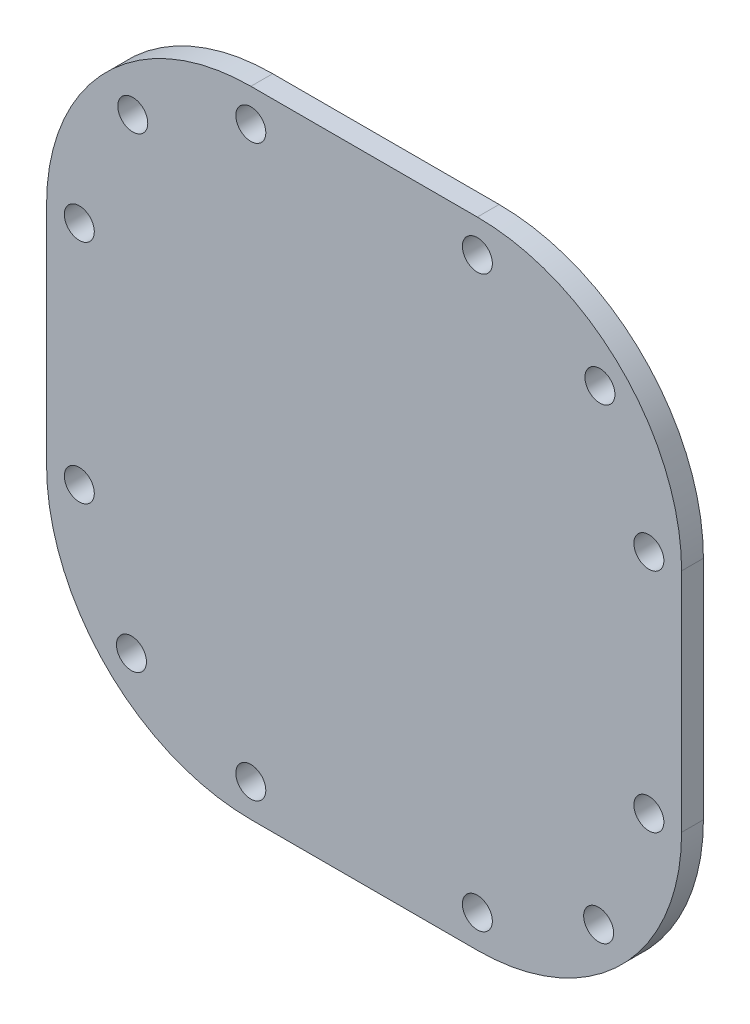
ISO-10303-21;
HEADER;
FILE_DESCRIPTION(('STEP AP214'),'2;1');
FILE_NAME('part.step','',(''),(''),'','','');
FILE_SCHEMA(('AUTOMOTIVE_DESIGN { 1 0 10303 214 1 1 1 1 }'));
ENDSEC;
DATA;
#1=APPLICATION_CONTEXT('core data for automotive mechanical design processes');
#2=APPLICATION_PROTOCOL_DEFINITION('international standard','automotive_design',2000,#1);
#3=PRODUCT_CONTEXT('',#1,'mechanical');
#4=PRODUCT('Part','Part','',(#3));
#5=PRODUCT_RELATED_PRODUCT_CATEGORY('part','',(#4));
#6=PRODUCT_DEFINITION_FORMATION('','',#4);
#7=PRODUCT_DEFINITION_CONTEXT('part definition',#1,'design');
#8=PRODUCT_DEFINITION('design','',#6,#7);
#9=PRODUCT_DEFINITION_SHAPE('','',#8);
#10=(LENGTH_UNIT() NAMED_UNIT(*) SI_UNIT(.MILLI.,.METRE.));
#11=(NAMED_UNIT(*) PLANE_ANGLE_UNIT() SI_UNIT($,.RADIAN.));
#12=(NAMED_UNIT(*) SI_UNIT($,.STERADIAN.) SOLID_ANGLE_UNIT());
#13=UNCERTAINTY_MEASURE_WITH_UNIT(LENGTH_MEASURE(1.E-05),#10,'distance_accuracy_value','');
#14=(GEOMETRIC_REPRESENTATION_CONTEXT(3) GLOBAL_UNCERTAINTY_ASSIGNED_CONTEXT((#13)) GLOBAL_UNIT_ASSIGNED_CONTEXT((#10,
#11,#12)) REPRESENTATION_CONTEXT('',''));
#15=CARTESIAN_POINT('',(0.,0.,0.));
#16=DIRECTION('',(0.,0.,1.));
#17=DIRECTION('',(1.,0.,0.));
#18=AXIS2_PLACEMENT_3D('',#15,#16,#17);
#19=CARTESIAN_POINT('',(-46.57725,46.57725,3.175));
#20=DIRECTION('',(0.,0.,-1.));
#21=DIRECTION('',(-1.,0.,0.));
#22=AXIS2_PLACEMENT_3D('',#19,#20,#21);
#23=PLANE('',#22);
#24=CARTESIAN_POINT('',(16.490011721749,-41.4629701831703,3.175));
#25=DIRECTION('',(0.,0.,1.));
#26=DIRECTION('',(1.,0.,0.));
#27=AXIS2_PLACEMENT_3D('',#24,#25,#26);
#28=CIRCLE('',#27,2.1828125);
#29=CARTESIAN_POINT('',(18.672824221749,-41.4629701831703,3.175));
#30=VERTEX_POINT('',#29);
#31=EDGE_CURVE('E11',#30,#30,#28,.T.);
#32=ORIENTED_EDGE('',*,*,#31,.F.);
#33=EDGE_LOOP('',(#32));
#34=FACE_BOUND('',#33,.T.);
#35=CARTESIAN_POINT('',(-41.4629701831717,-16.4922403663435,3.175));
#36=DIRECTION('',(0.,0.,1.));
#37=DIRECTION('',(1.,0.,0.));
#38=AXIS2_PLACEMENT_3D('',#35,#36,#37);
#39=CIRCLE('',#38,2.1828125);
#40=CARTESIAN_POINT('',(-39.2801576831717,-16.4922403663435,3.175));
#41=VERTEX_POINT('',#40);
#42=EDGE_CURVE('E174',#41,#41,#39,.T.);
#43=ORIENTED_EDGE('',*,*,#42,.F.);
#44=EDGE_LOOP('',(#43));
#45=FACE_BOUND('',#44,.T.);
#46=CARTESIAN_POINT('',(-16.4944690109381,-41.4629701831703,3.175));
#47=DIRECTION('',(0.,0.,1.));
#48=DIRECTION('',(1.,0.,0.));
#49=AXIS2_PLACEMENT_3D('',#46,#47,#48);
#50=CIRCLE('',#49,2.1828125);
#51=CARTESIAN_POINT('',(-14.3116565109381,-41.4629701831703,3.175));
#52=VERTEX_POINT('',#51);
#53=EDGE_CURVE('E181',#52,#52,#50,.T.);
#54=ORIENTED_EDGE('',*,*,#53,.F.);
#55=EDGE_LOOP('',(#54));
#56=FACE_BOUND('',#55,.T.);
#57=CARTESIAN_POINT('',(-33.8692708431518,-33.9592080618209,3.175));
#58=DIRECTION('',(0.,0.,1.));
#59=DIRECTION('',(1.,0.,0.));
#60=AXIS2_PLACEMENT_3D('',#57,#58,#59);
#61=CIRCLE('',#60,2.1828125);
#62=CARTESIAN_POINT('',(-31.6864583431518,-33.9592080618209,3.175));
#63=VERTEX_POINT('',#62);
#64=EDGE_CURVE('E168',#63,#63,#61,.T.);
#65=ORIENTED_EDGE('',*,*,#64,.F.);
#66=EDGE_LOOP('',(#65));
#67=FACE_BOUND('',#66,.T.);
#68=CARTESIAN_POINT('',(-41.4629701831717,16.4922403663436,3.175));
#69=DIRECTION('',(0.,0.,1.));
#70=DIRECTION('',(1.,0.,0.));
#71=AXIS2_PLACEMENT_3D('',#68,#69,#70);
#72=CIRCLE('',#71,2.1828125);
#73=CARTESIAN_POINT('',(-39.2801576831717,16.4922403663436,3.175));
#74=VERTEX_POINT('',#73);
#75=EDGE_CURVE('E228',#74,#74,#72,.T.);
#76=ORIENTED_EDGE('',*,*,#75,.F.);
#77=EDGE_LOOP('',(#76));
#78=FACE_BOUND('',#77,.T.);
#79=CARTESIAN_POINT('',(-33.6810550046073,34.0574866816963,3.175));
#80=DIRECTION('',(0.,0.,1.));
#81=DIRECTION('',(1.,0.,0.));
#82=AXIS2_PLACEMENT_3D('',#79,#80,#81);
#83=CIRCLE('',#82,2.1828125);
#84=CARTESIAN_POINT('',(-31.4982425046073,34.0574866816963,3.175));
#85=VERTEX_POINT('',#84);
#86=EDGE_CURVE('E222',#85,#85,#83,.T.);
#87=ORIENTED_EDGE('',*,*,#86,.F.);
#88=EDGE_LOOP('',(#87));
#89=FACE_BOUND('',#88,.T.);
#90=CARTESIAN_POINT('',(-16.4922403663449,41.4607415385772,3.175));
#91=DIRECTION('',(0.,0.,1.));
#92=DIRECTION('',(1.,0.,0.));
#93=AXIS2_PLACEMENT_3D('',#90,#91,#92);
#94=CIRCLE('',#93,2.1828125);
#95=CARTESIAN_POINT('',(-14.3094278663449,41.4607415385772,3.175));
#96=VERTEX_POINT('',#95);
#97=EDGE_CURVE('E216',#96,#96,#94,.T.);
#98=ORIENTED_EDGE('',*,*,#97,.F.);
#99=EDGE_LOOP('',(#98));
#100=FACE_BOUND('',#99,.T.);
#101=CARTESIAN_POINT('',(16.4922403663421,41.4607415385772,3.175));
#102=DIRECTION('',(0.,0.,1.));
#103=DIRECTION('',(1.,0.,0.));
#104=AXIS2_PLACEMENT_3D('',#101,#102,#103);
#105=CIRCLE('',#104,2.1828125);
#106=CARTESIAN_POINT('',(18.6750528663421,41.4607415385772,3.175));
#107=VERTEX_POINT('',#106);
#108=EDGE_CURVE('E210',#107,#107,#105,.T.);
#109=ORIENTED_EDGE('',*,*,#108,.F.);
#110=EDGE_LOOP('',(#109));
#111=FACE_BOUND('',#110,.T.);
#112=CARTESIAN_POINT('',(34.33563973891,33.8692708431518,3.175));
#113=DIRECTION('',(0.,0.,1.));
#114=DIRECTION('',(1.,0.,0.));
#115=AXIS2_PLACEMENT_3D('',#112,#113,#114);
#116=CIRCLE('',#115,2.1828125);
#117=CARTESIAN_POINT('',(36.51845223891,33.8692708431518,3.175));
#118=VERTEX_POINT('',#117);
#119=EDGE_CURVE('E204',#118,#118,#116,.T.);
#120=ORIENTED_EDGE('',*,*,#119,.F.);
#121=EDGE_LOOP('',(#120));
#122=FACE_BOUND('',#121,.T.);
#123=CARTESIAN_POINT('',(41.4607415385758,16.4900117217504,3.175));
#124=DIRECTION('',(0.,0.,1.));
#125=DIRECTION('',(1.,0.,0.));
#126=AXIS2_PLACEMENT_3D('',#123,#124,#125);
#127=CIRCLE('',#126,2.1828125);
#128=CARTESIAN_POINT('',(43.6435540385758,16.4900117217504,3.175));
#129=VERTEX_POINT('',#128);
#130=EDGE_CURVE('E198',#129,#129,#127,.T.);
#131=ORIENTED_EDGE('',*,*,#130,.F.);
#132=EDGE_LOOP('',(#131));
#133=FACE_BOUND('',#132,.T.);
#134=CARTESIAN_POINT('',(41.4607415385758,-16.4944690109366,3.175));
#135=DIRECTION('',(0.,0.,1.));
#136=DIRECTION('',(1.,0.,0.));
#137=AXIS2_PLACEMENT_3D('',#134,#135,#136);
#138=CIRCLE('',#137,2.1828125);
#139=CARTESIAN_POINT('',(43.6435540385758,-16.4944690109366,3.175));
#140=VERTEX_POINT('',#139);
#141=EDGE_CURVE('E192',#140,#140,#138,.T.);
#142=ORIENTED_EDGE('',*,*,#141,.F.);
#143=EDGE_LOOP('',(#142));
#144=FACE_BOUND('',#143,.T.);
#145=CARTESIAN_POINT('',(34.1474239003655,-34.1474239003655,3.175));
#146=DIRECTION('',(0.,0.,1.));
#147=DIRECTION('',(1.,0.,0.));
#148=AXIS2_PLACEMENT_3D('',#145,#146,#147);
#149=CIRCLE('',#148,2.1828125);
#150=CARTESIAN_POINT('',(36.3302364003655,-34.1474239003655,3.175));
#151=VERTEX_POINT('',#150);
#152=EDGE_CURVE('E186',#151,#151,#149,.T.);
#153=ORIENTED_EDGE('',*,*,#152,.F.);
#154=EDGE_LOOP('',(#153));
#155=FACE_BOUND('',#154,.T.);
#156=CARTESIAN_POINT('',(-16.4846,16.4846,3.175));
#157=DIRECTION('',(0.,0.,1.));
#158=DIRECTION('',(-1.,0.,0.));
#159=AXIS2_PLACEMENT_3D('',#156,#157,#158);
#160=CIRCLE('',#159,29.7434);
#161=CARTESIAN_POINT('',(-16.4846,46.228,3.175));
#162=VERTEX_POINT('',#161);
#163=CARTESIAN_POINT('',(-46.228,16.4846,3.175));
#164=VERTEX_POINT('',#163);
#165=EDGE_CURVE('E136',#162,#164,#160,.T.);
#166=ORIENTED_EDGE('',*,*,#165,.T.);
#167=DIRECTION('',(0.,-1.,0.));
#168=VECTOR('',#167,1.);
#169=CARTESIAN_POINT('',(-46.228,-16.4846,3.175));
#170=LINE('',#169,#168);
#171=CARTESIAN_POINT('',(-46.228,-16.4846,3.175));
#172=VERTEX_POINT('',#171);
#173=EDGE_CURVE('E139',#164,#172,#170,.T.);
#174=ORIENTED_EDGE('',*,*,#173,.T.);
#175=CARTESIAN_POINT('',(-16.4846,-16.4846,3.175));
#176=DIRECTION('',(0.,0.,1.));
#177=DIRECTION('',(-1.,0.,0.));
#178=AXIS2_PLACEMENT_3D('',#175,#176,#177);
#179=CIRCLE('',#178,29.7434);
#180=CARTESIAN_POINT('',(-16.4846,-46.228,3.175));
#181=VERTEX_POINT('',#180);
#182=EDGE_CURVE('E50',#172,#181,#179,.T.);
#183=ORIENTED_EDGE('',*,*,#182,.T.);
#184=DIRECTION('',(1.,0.,0.));
#185=VECTOR('',#184,1.);
#186=CARTESIAN_POINT('',(16.4846,-46.228,3.175));
#187=LINE('',#186,#185);
#188=CARTESIAN_POINT('',(16.4846,-46.228,3.175));
#189=VERTEX_POINT('',#188);
#190=EDGE_CURVE('E107',#181,#189,#187,.T.);
#191=ORIENTED_EDGE('',*,*,#190,.T.);
#192=CARTESIAN_POINT('',(16.4846,-16.4846,3.175));
#193=DIRECTION('',(0.,0.,1.));
#194=DIRECTION('',(-1.,0.,0.));
#195=AXIS2_PLACEMENT_3D('',#192,#193,#194);
#196=CIRCLE('',#195,29.7434);
#197=CARTESIAN_POINT('',(46.228,-16.4846,3.175));
#198=VERTEX_POINT('',#197);
#199=EDGE_CURVE('E144',#189,#198,#196,.T.);
#200=ORIENTED_EDGE('',*,*,#199,.T.);
#201=DIRECTION('',(0.,1.,0.));
#202=VECTOR('',#201,1.);
#203=CARTESIAN_POINT('',(46.228,-16.4846,3.175));
#204=LINE('',#203,#202);
#205=CARTESIAN_POINT('',(46.228,16.4846,3.175));
#206=VERTEX_POINT('',#205);
#207=EDGE_CURVE('E147',#198,#206,#204,.T.);
#208=ORIENTED_EDGE('',*,*,#207,.T.);
#209=CARTESIAN_POINT('',(16.4846,16.4846,3.175));
#210=DIRECTION('',(0.,0.,1.));
#211=DIRECTION('',(-1.,0.,0.));
#212=AXIS2_PLACEMENT_3D('',#209,#210,#211);
#213=CIRCLE('',#212,29.7434);
#214=CARTESIAN_POINT('',(16.4846,46.228,3.175));
#215=VERTEX_POINT('',#214);
#216=EDGE_CURVE('E150',#206,#215,#213,.T.);
#217=ORIENTED_EDGE('',*,*,#216,.T.);
#218=DIRECTION('',(-1.,0.,0.));
#219=VECTOR('',#218,1.);
#220=CARTESIAN_POINT('',(16.4846,46.228,3.175));
#221=LINE('',#220,#219);
#222=EDGE_CURVE('E153',#215,#162,#221,.T.);
#223=ORIENTED_EDGE('',*,*,#222,.T.);
#224=EDGE_LOOP('',(#166,#174,#183,#191,#200,#208,#217,#223));
#225=FACE_BOUND('',#224,.T.);
#226=ADVANCED_FACE('F35',(#34,#45,#56,#67,#78,#89,#100,#111,#122,#133,#144,#155,#225),#23,.F.);
#227=CARTESIAN_POINT('',(-46.57725,46.57725,0.));
#228=DIRECTION('',(0.,0.,-1.));
#229=DIRECTION('',(-1.,0.,0.));
#230=AXIS2_PLACEMENT_3D('',#227,#228,#229);
#231=PLANE('',#230);
#232=CARTESIAN_POINT('',(16.490011721749,-41.4629701831703,0.));
#233=DIRECTION('',(0.,0.,-1.));
#234=DIRECTION('',(-1.,0.,0.));
#235=AXIS2_PLACEMENT_3D('',#232,#233,#234);
#236=CIRCLE('',#235,2.1828125);
#237=CARTESIAN_POINT('',(14.307199221749,-41.4629701831703,0.));
#238=VERTEX_POINT('',#237);
#239=EDGE_CURVE('E39',#238,#238,#236,.F.);
#240=ORIENTED_EDGE('',*,*,#239,.T.);
#241=EDGE_LOOP('',(#240));
#242=FACE_BOUND('',#241,.T.);
#243=CARTESIAN_POINT('',(-41.4629701831717,-16.4922403663435,0.));
#244=DIRECTION('',(0.,0.,-1.));
#245=DIRECTION('',(-1.,0.,0.));
#246=AXIS2_PLACEMENT_3D('',#243,#244,#245);
#247=CIRCLE('',#246,2.1828125);
#248=CARTESIAN_POINT('',(-43.6457826831717,-16.4922403663435,0.));
#249=VERTEX_POINT('',#248);
#250=EDGE_CURVE('E178',#249,#249,#247,.F.);
#251=ORIENTED_EDGE('',*,*,#250,.T.);
#252=EDGE_LOOP('',(#251));
#253=FACE_BOUND('',#252,.T.);
#254=CARTESIAN_POINT('',(-16.4944690109381,-41.4629701831703,0.));
#255=DIRECTION('',(0.,0.,-1.));
#256=DIRECTION('',(-1.,0.,0.));
#257=AXIS2_PLACEMENT_3D('',#254,#255,#256);
#258=CIRCLE('',#257,2.1828125);
#259=CARTESIAN_POINT('',(-18.6772815109381,-41.4629701831703,0.));
#260=VERTEX_POINT('',#259);
#261=EDGE_CURVE('E171',#260,#260,#258,.F.);
#262=ORIENTED_EDGE('',*,*,#261,.T.);
#263=EDGE_LOOP('',(#262));
#264=FACE_BOUND('',#263,.T.);
#265=CARTESIAN_POINT('',(-33.8692708431518,-33.9592080618209,0.));
#266=DIRECTION('',(0.,0.,-1.));
#267=DIRECTION('',(-1.,0.,0.));
#268=AXIS2_PLACEMENT_3D('',#265,#266,#267);
#269=CIRCLE('',#268,2.1828125);
#270=CARTESIAN_POINT('',(-36.0520833431518,-33.9592080618209,0.));
#271=VERTEX_POINT('',#270);
#272=EDGE_CURVE('E158',#271,#271,#269,.F.);
#273=ORIENTED_EDGE('',*,*,#272,.T.);
#274=EDGE_LOOP('',(#273));
#275=FACE_BOUND('',#274,.T.);
#276=CARTESIAN_POINT('',(-41.4629701831717,16.4922403663436,0.));
#277=DIRECTION('',(0.,0.,-1.));
#278=DIRECTION('',(-1.,0.,0.));
#279=AXIS2_PLACEMENT_3D('',#276,#277,#278);
#280=CIRCLE('',#279,2.1828125);
#281=CARTESIAN_POINT('',(-43.6457826831717,16.4922403663436,0.));
#282=VERTEX_POINT('',#281);
#283=EDGE_CURVE('E177',#282,#282,#280,.F.);
#284=ORIENTED_EDGE('',*,*,#283,.T.);
#285=EDGE_LOOP('',(#284));
#286=FACE_BOUND('',#285,.T.);
#287=CARTESIAN_POINT('',(-33.6810550046073,34.0574866816963,0.));
#288=DIRECTION('',(0.,0.,-1.));
#289=DIRECTION('',(-1.,0.,0.));
#290=AXIS2_PLACEMENT_3D('',#287,#288,#289);
#291=CIRCLE('',#290,2.1828125);
#292=CARTESIAN_POINT('',(-35.8638675046073,34.0574866816963,0.));
#293=VERTEX_POINT('',#292);
#294=EDGE_CURVE('E225',#293,#293,#291,.F.);
#295=ORIENTED_EDGE('',*,*,#294,.T.);
#296=EDGE_LOOP('',(#295));
#297=FACE_BOUND('',#296,.T.);
#298=CARTESIAN_POINT('',(-16.4922403663449,41.4607415385772,0.));
#299=DIRECTION('',(0.,0.,-1.));
#300=DIRECTION('',(-1.,0.,0.));
#301=AXIS2_PLACEMENT_3D('',#298,#299,#300);
#302=CIRCLE('',#301,2.1828125);
#303=CARTESIAN_POINT('',(-18.6750528663449,41.4607415385772,0.));
#304=VERTEX_POINT('',#303);
#305=EDGE_CURVE('E219',#304,#304,#302,.F.);
#306=ORIENTED_EDGE('',*,*,#305,.T.);
#307=EDGE_LOOP('',(#306));
#308=FACE_BOUND('',#307,.T.);
#309=CARTESIAN_POINT('',(16.4922403663421,41.4607415385772,0.));
#310=DIRECTION('',(0.,0.,-1.));
#311=DIRECTION('',(-1.,0.,0.));
#312=AXIS2_PLACEMENT_3D('',#309,#310,#311);
#313=CIRCLE('',#312,2.1828125);
#314=CARTESIAN_POINT('',(14.3094278663421,41.4607415385772,0.));
#315=VERTEX_POINT('',#314);
#316=EDGE_CURVE('E213',#315,#315,#313,.F.);
#317=ORIENTED_EDGE('',*,*,#316,.T.);
#318=EDGE_LOOP('',(#317));
#319=FACE_BOUND('',#318,.T.);
#320=CARTESIAN_POINT('',(34.33563973891,33.8692708431518,0.));
#321=DIRECTION('',(0.,0.,-1.));
#322=DIRECTION('',(-1.,0.,0.));
#323=AXIS2_PLACEMENT_3D('',#320,#321,#322);
#324=CIRCLE('',#323,2.1828125);
#325=CARTESIAN_POINT('',(32.15282723891,33.8692708431518,0.));
#326=VERTEX_POINT('',#325);
#327=EDGE_CURVE('E207',#326,#326,#324,.F.);
#328=ORIENTED_EDGE('',*,*,#327,.T.);
#329=EDGE_LOOP('',(#328));
#330=FACE_BOUND('',#329,.T.);
#331=CARTESIAN_POINT('',(41.4607415385758,16.4900117217504,0.));
#332=DIRECTION('',(0.,0.,-1.));
#333=DIRECTION('',(-1.,0.,0.));
#334=AXIS2_PLACEMENT_3D('',#331,#332,#333);
#335=CIRCLE('',#334,2.1828125);
#336=CARTESIAN_POINT('',(39.2779290385758,16.4900117217504,0.));
#337=VERTEX_POINT('',#336);
#338=EDGE_CURVE('E201',#337,#337,#335,.F.);
#339=ORIENTED_EDGE('',*,*,#338,.T.);
#340=EDGE_LOOP('',(#339));
#341=FACE_BOUND('',#340,.T.);
#342=CARTESIAN_POINT('',(41.4607415385758,-16.4944690109366,0.));
#343=DIRECTION('',(0.,0.,-1.));
#344=DIRECTION('',(-1.,0.,0.));
#345=AXIS2_PLACEMENT_3D('',#342,#343,#344);
#346=CIRCLE('',#345,2.1828125);
#347=CARTESIAN_POINT('',(39.2779290385758,-16.4944690109366,0.));
#348=VERTEX_POINT('',#347);
#349=EDGE_CURVE('E195',#348,#348,#346,.F.);
#350=ORIENTED_EDGE('',*,*,#349,.T.);
#351=EDGE_LOOP('',(#350));
#352=FACE_BOUND('',#351,.T.);
#353=CARTESIAN_POINT('',(34.1474239003655,-34.1474239003655,0.));
#354=DIRECTION('',(0.,0.,-1.));
#355=DIRECTION('',(-1.,0.,0.));
#356=AXIS2_PLACEMENT_3D('',#353,#354,#355);
#357=CIRCLE('',#356,2.1828125);
#358=CARTESIAN_POINT('',(31.9646114003655,-34.1474239003655,0.));
#359=VERTEX_POINT('',#358);
#360=EDGE_CURVE('E189',#359,#359,#357,.F.);
#361=ORIENTED_EDGE('',*,*,#360,.T.);
#362=EDGE_LOOP('',(#361));
#363=FACE_BOUND('',#362,.T.);
#364=DIRECTION('',(0.,-1.,0.));
#365=VECTOR('',#364,1.);
#366=CARTESIAN_POINT('',(-46.228,-16.4846,0.));
#367=LINE('',#366,#365);
#368=CARTESIAN_POINT('',(-46.228,16.4846,0.));
#369=VERTEX_POINT('',#368);
#370=CARTESIAN_POINT('',(-46.228,-16.4846,0.));
#371=VERTEX_POINT('',#370);
#372=EDGE_CURVE('E117',#369,#371,#367,.T.);
#373=ORIENTED_EDGE('',*,*,#372,.F.);
#374=CARTESIAN_POINT('',(-16.4846,16.4846,0.));
#375=DIRECTION('',(0.,0.,1.));
#376=DIRECTION('',(-1.,0.,0.));
#377=AXIS2_PLACEMENT_3D('',#374,#375,#376);
#378=CIRCLE('',#377,29.7434);
#379=CARTESIAN_POINT('',(-16.4846,46.228,0.));
#380=VERTEX_POINT('',#379);
#381=EDGE_CURVE('E58',#380,#369,#378,.T.);
#382=ORIENTED_EDGE('',*,*,#381,.F.);
#383=DIRECTION('',(-1.,0.,0.));
#384=VECTOR('',#383,1.);
#385=CARTESIAN_POINT('',(16.4846,46.228,0.));
#386=LINE('',#385,#384);
#387=CARTESIAN_POINT('',(16.4846,46.228,0.));
#388=VERTEX_POINT('',#387);
#389=EDGE_CURVE('E132',#388,#380,#386,.T.);
#390=ORIENTED_EDGE('',*,*,#389,.F.);
#391=CARTESIAN_POINT('',(16.4846,16.4846,0.));
#392=DIRECTION('',(0.,0.,1.));
#393=DIRECTION('',(-1.,0.,0.));
#394=AXIS2_PLACEMENT_3D('',#391,#392,#393);
#395=CIRCLE('',#394,29.7434);
#396=CARTESIAN_POINT('',(46.228,16.4846,0.));
#397=VERTEX_POINT('',#396);
#398=EDGE_CURVE('E129',#397,#388,#395,.T.);
#399=ORIENTED_EDGE('',*,*,#398,.F.);
#400=DIRECTION('',(0.,1.,0.));
#401=VECTOR('',#400,1.);
#402=CARTESIAN_POINT('',(46.228,-16.4846,0.));
#403=LINE('',#402,#401);
#404=CARTESIAN_POINT('',(46.228,-16.4846,0.));
#405=VERTEX_POINT('',#404);
#406=EDGE_CURVE('E123',#405,#397,#403,.T.);
#407=ORIENTED_EDGE('',*,*,#406,.F.);
#408=CARTESIAN_POINT('',(16.4846,-16.4846,0.));
#409=DIRECTION('',(0.,0.,1.));
#410=DIRECTION('',(-1.,0.,0.));
#411=AXIS2_PLACEMENT_3D('',#408,#409,#410);
#412=CIRCLE('',#411,29.7434);
#413=CARTESIAN_POINT('',(16.4846,-46.228,0.));
#414=VERTEX_POINT('',#413);
#415=EDGE_CURVE('E121',#414,#405,#412,.T.);
#416=ORIENTED_EDGE('',*,*,#415,.F.);
#417=DIRECTION('',(1.,0.,0.));
#418=VECTOR('',#417,1.);
#419=CARTESIAN_POINT('',(16.4846,-46.228,0.));
#420=LINE('',#419,#418);
#421=CARTESIAN_POINT('',(-16.4846,-46.228,0.));
#422=VERTEX_POINT('',#421);
#423=EDGE_CURVE('E104',#422,#414,#420,.T.);
#424=ORIENTED_EDGE('',*,*,#423,.F.);
#425=CARTESIAN_POINT('',(-16.4846,-16.4846,0.));
#426=DIRECTION('',(0.,0.,1.));
#427=DIRECTION('',(-1.,0.,0.));
#428=AXIS2_PLACEMENT_3D('',#425,#426,#427);
#429=CIRCLE('',#428,29.7434);
#430=EDGE_CURVE('E112',#371,#422,#429,.T.);
#431=ORIENTED_EDGE('',*,*,#430,.F.);
#432=EDGE_LOOP('',(#373,#382,#390,#399,#407,#416,#424,#431));
#433=FACE_BOUND('',#432,.T.);
#434=ADVANCED_FACE('F37',(#242,#253,#264,#275,#286,#297,#308,#319,#330,#341,#352,#363,#433),
#231,.T.);
#435=CARTESIAN_POINT('',(16.490011721749,-41.4629701831703,-0.00100000000000013));
#436=DIRECTION('',(0.,0.,1.));
#437=DIRECTION('',(1.,0.,0.));
#438=AXIS2_PLACEMENT_3D('',#435,#436,#437);
#439=CYLINDRICAL_SURFACE('',#438,2.1828125);
#440=ORIENTED_EDGE('',*,*,#239,.F.);
#441=EDGE_LOOP('',(#440));
#442=FACE_BOUND('',#441,.T.);
#443=ORIENTED_EDGE('',*,*,#31,.T.);
#444=EDGE_LOOP('',(#443));
#445=FACE_BOUND('',#444,.T.);
#446=ADVANCED_FACE('F305',(#442,#445),#439,.F.);
#447=CARTESIAN_POINT('',(-41.4629701831717,-16.4922403663435,-0.00100000000000013));
#448=DIRECTION('',(0.,0.,1.));
#449=DIRECTION('',(1.,0.,0.));
#450=AXIS2_PLACEMENT_3D('',#447,#448,#449);
#451=CYLINDRICAL_SURFACE('',#450,2.1828125);
#452=ORIENTED_EDGE('',*,*,#250,.F.);
#453=EDGE_LOOP('',(#452));
#454=FACE_BOUND('',#453,.T.);
#455=ORIENTED_EDGE('',*,*,#42,.T.);
#456=EDGE_LOOP('',(#455));
#457=FACE_BOUND('',#456,.T.);
#458=ADVANCED_FACE('F302',(#454,#457),#451,.F.);
#459=CARTESIAN_POINT('',(-16.4944690109381,-41.4629701831703,-0.00100000000000013));
#460=DIRECTION('',(0.,0.,1.));
#461=DIRECTION('',(1.,0.,0.));
#462=AXIS2_PLACEMENT_3D('',#459,#460,#461);
#463=CYLINDRICAL_SURFACE('',#462,2.1828125);
#464=ORIENTED_EDGE('',*,*,#261,.F.);
#465=EDGE_LOOP('',(#464));
#466=FACE_BOUND('',#465,.T.);
#467=ORIENTED_EDGE('',*,*,#53,.T.);
#468=EDGE_LOOP('',(#467));
#469=FACE_BOUND('',#468,.T.);
#470=ADVANCED_FACE('F300',(#466,#469),#463,.F.);
#471=CARTESIAN_POINT('',(-33.8692708431518,-33.9592080618209,-0.00100000000000013));
#472=DIRECTION('',(0.,0.,1.));
#473=DIRECTION('',(1.,0.,0.));
#474=AXIS2_PLACEMENT_3D('',#471,#472,#473);
#475=CYLINDRICAL_SURFACE('',#474,2.1828125);
#476=ORIENTED_EDGE('',*,*,#272,.F.);
#477=EDGE_LOOP('',(#476));
#478=FACE_BOUND('',#477,.T.);
#479=ORIENTED_EDGE('',*,*,#64,.T.);
#480=EDGE_LOOP('',(#479));
#481=FACE_BOUND('',#480,.T.);
#482=ADVANCED_FACE('F240',(#478,#481),#475,.F.);
#483=CARTESIAN_POINT('',(-41.4629701831717,16.4922403663436,-0.00100000000000013));
#484=DIRECTION('',(0.,0.,1.));
#485=DIRECTION('',(1.,0.,0.));
#486=AXIS2_PLACEMENT_3D('',#483,#484,#485);
#487=CYLINDRICAL_SURFACE('',#486,2.1828125);
#488=ORIENTED_EDGE('',*,*,#283,.F.);
#489=EDGE_LOOP('',(#488));
#490=FACE_BOUND('',#489,.T.);
#491=ORIENTED_EDGE('',*,*,#75,.T.);
#492=EDGE_LOOP('',(#491));
#493=FACE_BOUND('',#492,.T.);
#494=ADVANCED_FACE('F236',(#490,#493),#487,.F.);
#495=CARTESIAN_POINT('',(-33.6810550046073,34.0574866816963,-0.00100000000000013));
#496=DIRECTION('',(0.,0.,1.));
#497=DIRECTION('',(1.,0.,0.));
#498=AXIS2_PLACEMENT_3D('',#495,#496,#497);
#499=CYLINDRICAL_SURFACE('',#498,2.1828125);
#500=ORIENTED_EDGE('',*,*,#294,.F.);
#501=EDGE_LOOP('',(#500));
#502=FACE_BOUND('',#501,.T.);
#503=ORIENTED_EDGE('',*,*,#86,.T.);
#504=EDGE_LOOP('',(#503));
#505=FACE_BOUND('',#504,.T.);
#506=ADVANCED_FACE('F239',(#502,#505),#499,.F.);
#507=CARTESIAN_POINT('',(-16.4922403663449,41.4607415385772,-0.00100000000000013));
#508=DIRECTION('',(0.,0.,1.));
#509=DIRECTION('',(1.,0.,0.));
#510=AXIS2_PLACEMENT_3D('',#507,#508,#509);
#511=CYLINDRICAL_SURFACE('',#510,2.1828125);
#512=ORIENTED_EDGE('',*,*,#305,.F.);
#513=EDGE_LOOP('',(#512));
#514=FACE_BOUND('',#513,.T.);
#515=ORIENTED_EDGE('',*,*,#97,.T.);
#516=EDGE_LOOP('',(#515));
#517=FACE_BOUND('',#516,.T.);
#518=ADVANCED_FACE('F328',(#514,#517),#511,.F.);
#519=CARTESIAN_POINT('',(16.4922403663421,41.4607415385772,-0.00100000000000013));
#520=DIRECTION('',(0.,0.,1.));
#521=DIRECTION('',(1.,0.,0.));
#522=AXIS2_PLACEMENT_3D('',#519,#520,#521);
#523=CYLINDRICAL_SURFACE('',#522,2.1828125);
#524=ORIENTED_EDGE('',*,*,#316,.F.);
#525=EDGE_LOOP('',(#524));
#526=FACE_BOUND('',#525,.T.);
#527=ORIENTED_EDGE('',*,*,#108,.T.);
#528=EDGE_LOOP('',(#527));
#529=FACE_BOUND('',#528,.T.);
#530=ADVANCED_FACE('F324',(#526,#529),#523,.F.);
#531=CARTESIAN_POINT('',(34.33563973891,33.8692708431518,-0.00100000000000013));
#532=DIRECTION('',(0.,0.,1.));
#533=DIRECTION('',(1.,0.,0.));
#534=AXIS2_PLACEMENT_3D('',#531,#532,#533);
#535=CYLINDRICAL_SURFACE('',#534,2.1828125);
#536=ORIENTED_EDGE('',*,*,#327,.F.);
#537=EDGE_LOOP('',(#536));
#538=FACE_BOUND('',#537,.T.);
#539=ORIENTED_EDGE('',*,*,#119,.T.);
#540=EDGE_LOOP('',(#539));
#541=FACE_BOUND('',#540,.T.);
#542=ADVANCED_FACE('F320',(#538,#541),#535,.F.);
#543=CARTESIAN_POINT('',(41.4607415385758,16.4900117217504,-0.00100000000000013));
#544=DIRECTION('',(0.,0.,1.));
#545=DIRECTION('',(1.,0.,0.));
#546=AXIS2_PLACEMENT_3D('',#543,#544,#545);
#547=CYLINDRICAL_SURFACE('',#546,2.1828125);
#548=ORIENTED_EDGE('',*,*,#338,.F.);
#549=EDGE_LOOP('',(#548));
#550=FACE_BOUND('',#549,.T.);
#551=ORIENTED_EDGE('',*,*,#130,.T.);
#552=EDGE_LOOP('',(#551));
#553=FACE_BOUND('',#552,.T.);
#554=ADVANCED_FACE('F316',(#550,#553),#547,.F.);
#555=CARTESIAN_POINT('',(41.4607415385758,-16.4944690109366,-0.00100000000000013));
#556=DIRECTION('',(0.,0.,1.));
#557=DIRECTION('',(1.,0.,0.));
#558=AXIS2_PLACEMENT_3D('',#555,#556,#557);
#559=CYLINDRICAL_SURFACE('',#558,2.1828125);
#560=ORIENTED_EDGE('',*,*,#349,.F.);
#561=EDGE_LOOP('',(#560));
#562=FACE_BOUND('',#561,.T.);
#563=ORIENTED_EDGE('',*,*,#141,.T.);
#564=EDGE_LOOP('',(#563));
#565=FACE_BOUND('',#564,.T.);
#566=ADVANCED_FACE('F312',(#562,#565),#559,.F.);
#567=CARTESIAN_POINT('',(34.1474239003655,-34.1474239003655,-0.00100000000000013));
#568=DIRECTION('',(0.,0.,1.));
#569=DIRECTION('',(1.,0.,0.));
#570=AXIS2_PLACEMENT_3D('',#567,#568,#569);
#571=CYLINDRICAL_SURFACE('',#570,2.1828125);
#572=ORIENTED_EDGE('',*,*,#360,.F.);
#573=EDGE_LOOP('',(#572));
#574=FACE_BOUND('',#573,.T.);
#575=ORIENTED_EDGE('',*,*,#152,.T.);
#576=EDGE_LOOP('',(#575));
#577=FACE_BOUND('',#576,.T.);
#578=ADVANCED_FACE('F297',(#574,#577),#571,.F.);
#579=CARTESIAN_POINT('',(-16.4846,16.4846,0.));
#580=DIRECTION('',(0.,0.,1.));
#581=DIRECTION('',(1.,0.,0.));
#582=AXIS2_PLACEMENT_3D('',#579,#580,#581);
#583=CYLINDRICAL_SURFACE('',#582,29.7434);
#584=ORIENTED_EDGE('',*,*,#165,.F.);
#585=DIRECTION('',(0.,0.,1.));
#586=VECTOR('',#585,1.);
#587=CARTESIAN_POINT('',(-16.4846,46.228,0.));
#588=LINE('',#587,#586);
#589=EDGE_CURVE('E156',#380,#162,#588,.T.);
#590=ORIENTED_EDGE('',*,*,#589,.F.);
#591=ORIENTED_EDGE('',*,*,#381,.T.);
#592=DIRECTION('',(0.,0.,1.));
#593=VECTOR('',#592,1.);
#594=CARTESIAN_POINT('',(-46.228,16.4846,0.));
#595=LINE('',#594,#593);
#596=EDGE_CURVE('E135',#369,#164,#595,.T.);
#597=ORIENTED_EDGE('',*,*,#596,.T.);
#598=EDGE_LOOP('',(#584,#590,#591,#597));
#599=FACE_BOUND('',#598,.T.);
#600=ADVANCED_FACE('F264',(#599),#583,.T.);
#601=CARTESIAN_POINT('',(16.4846,46.228,0.));
#602=DIRECTION('',(0.,1.,0.));
#603=DIRECTION('',(-1.,0.,0.));
#604=AXIS2_PLACEMENT_3D('',#601,#602,#603);
#605=PLANE('',#604);
#606=ORIENTED_EDGE('',*,*,#222,.F.);
#607=DIRECTION('',(0.,0.,1.));
#608=VECTOR('',#607,1.);
#609=CARTESIAN_POINT('',(16.4846,46.228,0.));
#610=LINE('',#609,#608);
#611=EDGE_CURVE('E159',#388,#215,#610,.T.);
#612=ORIENTED_EDGE('',*,*,#611,.F.);
#613=ORIENTED_EDGE('',*,*,#389,.T.);
#614=ORIENTED_EDGE('',*,*,#589,.T.);
#615=EDGE_LOOP('',(#606,#612,#613,#614));
#616=FACE_BOUND('',#615,.T.);
#617=ADVANCED_FACE('F271',(#616),#605,.T.);
#618=CARTESIAN_POINT('',(16.4846,16.4846,0.));
#619=DIRECTION('',(0.,0.,1.));
#620=DIRECTION('',(1.,0.,0.));
#621=AXIS2_PLACEMENT_3D('',#618,#619,#620);
#622=CYLINDRICAL_SURFACE('',#621,29.7434);
#623=ORIENTED_EDGE('',*,*,#216,.F.);
#624=DIRECTION('',(0.,0.,1.));
#625=VECTOR('',#624,1.);
#626=CARTESIAN_POINT('',(46.228,16.4846,0.));
#627=LINE('',#626,#625);
#628=EDGE_CURVE('E161',#397,#206,#627,.T.);
#629=ORIENTED_EDGE('',*,*,#628,.F.);
#630=ORIENTED_EDGE('',*,*,#398,.T.);
#631=ORIENTED_EDGE('',*,*,#611,.T.);
#632=EDGE_LOOP('',(#623,#629,#630,#631));
#633=FACE_BOUND('',#632,.T.);
#634=ADVANCED_FACE('F274',(#633),#622,.T.);
#635=CARTESIAN_POINT('',(46.228,-16.4846,0.));
#636=DIRECTION('',(1.,0.,0.));
#637=DIRECTION('',(0.,0.,-1.));
#638=AXIS2_PLACEMENT_3D('',#635,#636,#637);
#639=PLANE('',#638);
#640=ORIENTED_EDGE('',*,*,#207,.F.);
#641=DIRECTION('',(0.,0.,1.));
#642=VECTOR('',#641,1.);
#643=CARTESIAN_POINT('',(46.228,-16.4846,0.));
#644=LINE('',#643,#642);
#645=EDGE_CURVE('E163',#405,#198,#644,.T.);
#646=ORIENTED_EDGE('',*,*,#645,.F.);
#647=ORIENTED_EDGE('',*,*,#406,.T.);
#648=ORIENTED_EDGE('',*,*,#628,.T.);
#649=EDGE_LOOP('',(#640,#646,#647,#648));
#650=FACE_BOUND('',#649,.T.);
#651=ADVANCED_FACE('F277',(#650),#639,.T.);
#652=CARTESIAN_POINT('',(16.4846,-16.4846,0.));
#653=DIRECTION('',(0.,0.,1.));
#654=DIRECTION('',(1.,0.,0.));
#655=AXIS2_PLACEMENT_3D('',#652,#653,#654);
#656=CYLINDRICAL_SURFACE('',#655,29.7434);
#657=ORIENTED_EDGE('',*,*,#199,.F.);
#658=DIRECTION('',(0.,0.,1.));
#659=VECTOR('',#658,1.);
#660=CARTESIAN_POINT('',(16.4846,-46.228,0.));
#661=LINE('',#660,#659);
#662=EDGE_CURVE('E108',#414,#189,#661,.T.);
#663=ORIENTED_EDGE('',*,*,#662,.F.);
#664=ORIENTED_EDGE('',*,*,#415,.T.);
#665=ORIENTED_EDGE('',*,*,#645,.T.);
#666=EDGE_LOOP('',(#657,#663,#664,#665));
#667=FACE_BOUND('',#666,.T.);
#668=ADVANCED_FACE('F280',(#667),#656,.T.);
#669=CARTESIAN_POINT('',(16.4846,-46.228,0.));
#670=DIRECTION('',(0.,-1.,0.));
#671=DIRECTION('',(0.,0.,-1.));
#672=AXIS2_PLACEMENT_3D('',#669,#670,#671);
#673=PLANE('',#672);
#674=ORIENTED_EDGE('',*,*,#190,.F.);
#675=DIRECTION('',(0.,0.,1.));
#676=VECTOR('',#675,1.);
#677=CARTESIAN_POINT('',(-16.4846,-46.228,0.));
#678=LINE('',#677,#676);
#679=EDGE_CURVE('E100',#422,#181,#678,.T.);
#680=ORIENTED_EDGE('',*,*,#679,.F.);
#681=ORIENTED_EDGE('',*,*,#423,.T.);
#682=ORIENTED_EDGE('',*,*,#662,.T.);
#683=EDGE_LOOP('',(#674,#680,#681,#682));
#684=FACE_BOUND('',#683,.T.);
#685=ADVANCED_FACE('F102',(#684),#673,.T.);
#686=CARTESIAN_POINT('',(-16.4846,-16.4846,0.));
#687=DIRECTION('',(0.,0.,1.));
#688=DIRECTION('',(1.,0.,0.));
#689=AXIS2_PLACEMENT_3D('',#686,#687,#688);
#690=CYLINDRICAL_SURFACE('',#689,29.7434);
#691=ORIENTED_EDGE('',*,*,#182,.F.);
#692=DIRECTION('',(0.,0.,1.));
#693=VECTOR('',#692,1.);
#694=CARTESIAN_POINT('',(-46.228,-16.4846,0.));
#695=LINE('',#694,#693);
#696=EDGE_CURVE('E109',#371,#172,#695,.T.);
#697=ORIENTED_EDGE('',*,*,#696,.F.);
#698=ORIENTED_EDGE('',*,*,#430,.T.);
#699=ORIENTED_EDGE('',*,*,#679,.T.);
#700=EDGE_LOOP('',(#691,#697,#698,#699));
#701=FACE_BOUND('',#700,.T.);
#702=ADVANCED_FACE('F113',(#701),#690,.T.);
#703=CARTESIAN_POINT('',(-46.228,-16.4846,0.));
#704=DIRECTION('',(-1.,0.,0.));
#705=DIRECTION('',(0.,0.,1.));
#706=AXIS2_PLACEMENT_3D('',#703,#704,#705);
#707=PLANE('',#706);
#708=ORIENTED_EDGE('',*,*,#173,.F.);
#709=ORIENTED_EDGE('',*,*,#596,.F.);
#710=ORIENTED_EDGE('',*,*,#372,.T.);
#711=ORIENTED_EDGE('',*,*,#696,.T.);
#712=EDGE_LOOP('',(#708,#709,#710,#711));
#713=FACE_BOUND('',#712,.T.);
#714=ADVANCED_FACE('F266',(#713),#707,.T.);
#715=CLOSED_SHELL('',(#226,#434,#446,#458,#470,#482,#494,#506,#518,#530,#542,#554,#566,#578,
#600,#617,#634,#651,#668,#685,#702,#714));
#716=MANIFOLD_SOLID_BREP('B2',#715);
#717=ADVANCED_BREP_SHAPE_REPRESENTATION('',(#18,#716),#14);
#718=SHAPE_DEFINITION_REPRESENTATION(#9,#717);
ENDSEC;
END-ISO-10303-21;
